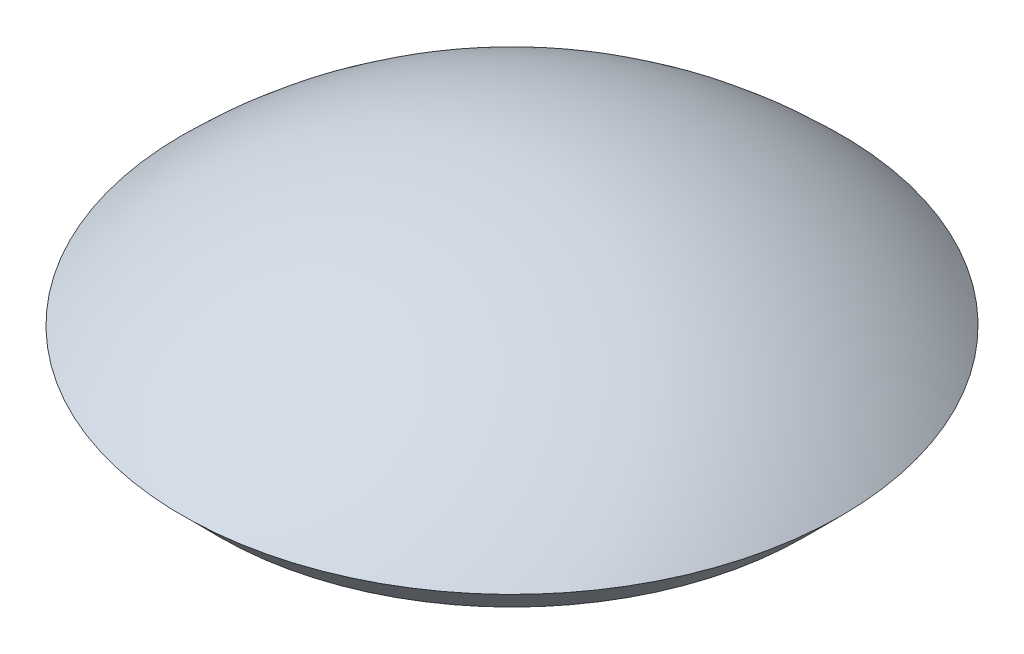
ISO-10303-21;
HEADER;
FILE_DESCRIPTION(('STEP AP214'),'2;1');
FILE_NAME('part.step','',(''),(''),'','','');
FILE_SCHEMA(('AUTOMOTIVE_DESIGN { 1 0 10303 214 1 1 1 1 }'));
ENDSEC;
DATA;
#1=APPLICATION_CONTEXT('core data for automotive mechanical design processes');
#2=APPLICATION_PROTOCOL_DEFINITION('international standard','automotive_design',2000,#1);
#3=PRODUCT_CONTEXT('',#1,'mechanical');
#4=PRODUCT('Part','Part','',(#3));
#5=PRODUCT_RELATED_PRODUCT_CATEGORY('part','',(#4));
#6=PRODUCT_DEFINITION_FORMATION('','',#4);
#7=PRODUCT_DEFINITION_CONTEXT('part definition',#1,'design');
#8=PRODUCT_DEFINITION('design','',#6,#7);
#9=PRODUCT_DEFINITION_SHAPE('','',#8);
#10=(LENGTH_UNIT() NAMED_UNIT(*) SI_UNIT(.MILLI.,.METRE.));
#11=(NAMED_UNIT(*) PLANE_ANGLE_UNIT() SI_UNIT($,.RADIAN.));
#12=(NAMED_UNIT(*) SI_UNIT($,.STERADIAN.) SOLID_ANGLE_UNIT());
#13=UNCERTAINTY_MEASURE_WITH_UNIT(LENGTH_MEASURE(1.E-05),#10,'distance_accuracy_value','');
#14=(GEOMETRIC_REPRESENTATION_CONTEXT(3) GLOBAL_UNCERTAINTY_ASSIGNED_CONTEXT((#13)) GLOBAL_UNIT_ASSIGNED_CONTEXT((#10,
#11,#12)) REPRESENTATION_CONTEXT('',''));
#15=CARTESIAN_POINT('',(0.,0.,0.));
#16=DIRECTION('',(0.,0.,1.));
#17=DIRECTION('',(1.,0.,0.));
#18=AXIS2_PLACEMENT_3D('',#15,#16,#17);
#19=CARTESIAN_POINT('',(0.,-50.,0.));
#20=DIRECTION('',(0.,1.,0.));
#21=DIRECTION('',(-1.,0.,0.));
#22=AXIS2_PLACEMENT_3D('',#19,#20,#21);
#23=SPHERICAL_SURFACE('',#22,25.);
#24=CARTESIAN_POINT('',(0.,-32.3223304703363,0.));
#25=DIRECTION('',(0.,1.,0.));
#26=DIRECTION('',(-1.,0.,0.));
#27=AXIS2_PLACEMENT_3D('',#24,#25,#26);
#28=CIRCLE('',#27,17.6776695296637);
#29=CARTESIAN_POINT('',(-17.6776695296637,-32.3223304703363,0.));
#30=VERTEX_POINT('',#29);
#31=EDGE_CURVE('E10',#30,#30,#28,.T.);
#32=ORIENTED_EDGE('',*,*,#31,.F.);
#33=EDGE_LOOP('',(#32));
#34=FACE_BOUND('',#33,.T.);
#35=ADVANCED_FACE('F30',(#34),#23,.F.);
#36=CARTESIAN_POINT('',(0.,-32.3223304703363,0.));
#37=DIRECTION('',(0.,1.,0.));
#38=DIRECTION('',(-1.,0.,0.));
#39=AXIS2_PLACEMENT_3D('',#36,#37,#38);
#40=CONICAL_SURFACE('',#39,17.6776695296637,0.785398163397448);
#41=CARTESIAN_POINT('',(0.,-30.0506475743046,0.));
#42=DIRECTION('',(0.,1.,0.));
#43=DIRECTION('',(-1.,0.,0.));
#44=AXIS2_PLACEMENT_3D('',#41,#42,#43);
#45=CIRCLE('',#44,19.9493524256953);
#46=CARTESIAN_POINT('',(-19.9493524256953,-30.0506475743046,0.));
#47=VERTEX_POINT('',#46);
#48=EDGE_CURVE('E36',#47,#47,#45,.T.);
#49=ORIENTED_EDGE('',*,*,#48,.F.);
#50=EDGE_LOOP('',(#49));
#51=FACE_BOUND('',#50,.T.);
#52=ORIENTED_EDGE('',*,*,#31,.T.);
#53=EDGE_LOOP('',(#52));
#54=FACE_BOUND('',#53,.T.);
#55=ADVANCED_FACE('F44',(#51,#54),#40,.T.);
#56=CARTESIAN_POINT('',(0.,-50.,0.));
#57=DIRECTION('',(0.,1.,0.));
#58=DIRECTION('',(1.,0.,0.));
#59=AXIS2_PLACEMENT_3D('',#56,#57,#58);
#60=SPHERICAL_SURFACE('',#59,28.2126447609789);
#61=ORIENTED_EDGE('',*,*,#48,.T.);
#62=EDGE_LOOP('',(#61));
#63=FACE_BOUND('',#62,.T.);
#64=ADVANCED_FACE('F42',(#63),#60,.T.);
#65=CLOSED_SHELL('',(#35,#55,#64));
#66=MANIFOLD_SOLID_BREP('B2',#65);
#67=ADVANCED_BREP_SHAPE_REPRESENTATION('',(#18,#66),#14);
#68=SHAPE_DEFINITION_REPRESENTATION(#9,#67);
ENDSEC;
END-ISO-10303-21;
